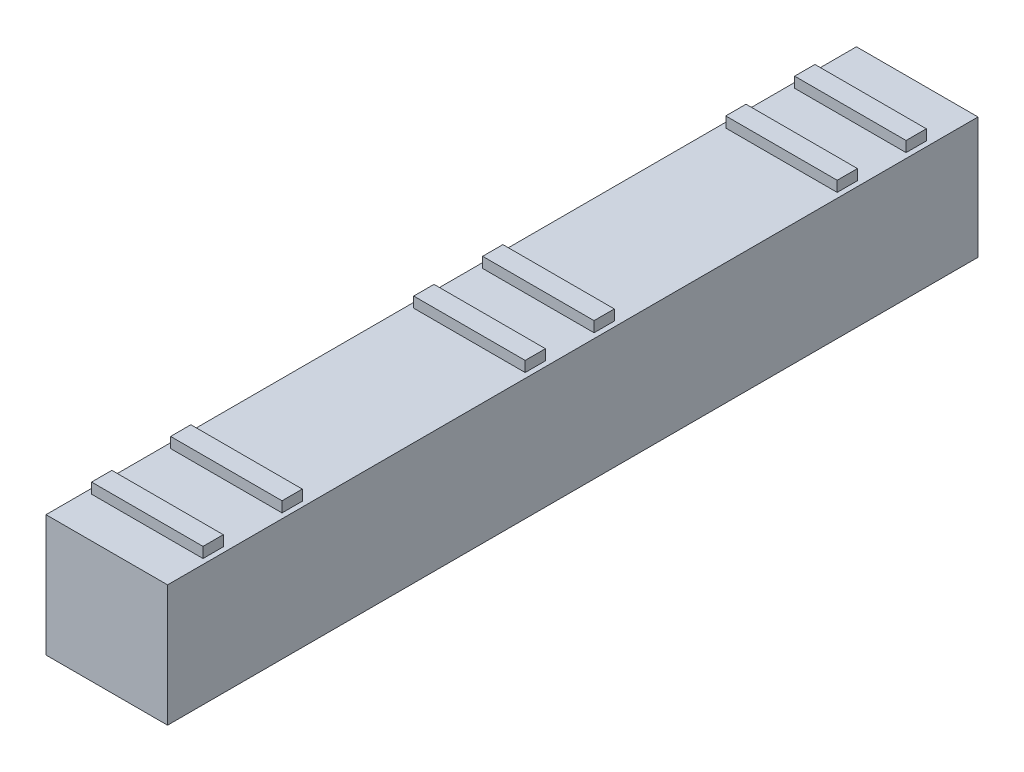
ISO-10303-21;
HEADER;
FILE_DESCRIPTION(('STEP AP214'),'2;1');
FILE_NAME('part.step','',(''),(''),'','','');
FILE_SCHEMA(('AUTOMOTIVE_DESIGN { 1 0 10303 214 1 1 1 1 }'));
ENDSEC;
DATA;
#1=APPLICATION_CONTEXT('core data for automotive mechanical design processes');
#2=APPLICATION_PROTOCOL_DEFINITION('international standard','automotive_design',2000,#1);
#3=PRODUCT_CONTEXT('',#1,'mechanical');
#4=PRODUCT('Part','Part','',(#3));
#5=PRODUCT_RELATED_PRODUCT_CATEGORY('part','',(#4));
#6=PRODUCT_DEFINITION_FORMATION('','',#4);
#7=PRODUCT_DEFINITION_CONTEXT('part definition',#1,'design');
#8=PRODUCT_DEFINITION('design','',#6,#7);
#9=PRODUCT_DEFINITION_SHAPE('','',#8);
#10=(LENGTH_UNIT() NAMED_UNIT(*) SI_UNIT(.MILLI.,.METRE.));
#11=(NAMED_UNIT(*) PLANE_ANGLE_UNIT() SI_UNIT($,.RADIAN.));
#12=(NAMED_UNIT(*) SI_UNIT($,.STERADIAN.) SOLID_ANGLE_UNIT());
#13=UNCERTAINTY_MEASURE_WITH_UNIT(LENGTH_MEASURE(1.E-05),#10,'distance_accuracy_value','');
#14=(GEOMETRIC_REPRESENTATION_CONTEXT(3) GLOBAL_UNCERTAINTY_ASSIGNED_CONTEXT((#13)) GLOBAL_UNIT_ASSIGNED_CONTEXT((#10,
#11,#12)) REPRESENTATION_CONTEXT('',''));
#15=CARTESIAN_POINT('',(0.,0.,0.));
#16=DIRECTION('',(0.,0.,1.));
#17=DIRECTION('',(1.,0.,0.));
#18=AXIS2_PLACEMENT_3D('',#15,#16,#17);
#19=CARTESIAN_POINT('',(0.,30.,0.));
#20=DIRECTION('',(0.,-1.,0.));
#21=DIRECTION('',(0.,0.,-1.));
#22=AXIS2_PLACEMENT_3D('',#19,#20,#21);
#23=PLANE('',#22);
#24=DIRECTION('',(0.,0.,-1.));
#25=VECTOR('',#24,1.);
#26=CARTESIAN_POINT('',(13.75,30.,-71.5));
#27=LINE('',#26,#25);
#28=CARTESIAN_POINT('',(13.75,30.,-66.5));
#29=VERTEX_POINT('',#28);
#30=CARTESIAN_POINT('',(13.75,30.,-71.5));
#31=VERTEX_POINT('',#30);
#32=EDGE_CURVE('E245',#29,#31,#27,.T.);
#33=ORIENTED_EDGE('',*,*,#32,.F.);
#34=DIRECTION('',(1.,0.,0.));
#35=VECTOR('',#34,1.);
#36=CARTESIAN_POINT('',(-13.75,30.,-66.5));
#37=LINE('',#36,#35);
#38=CARTESIAN_POINT('',(-13.75,30.,-66.5));
#39=VERTEX_POINT('',#38);
#40=EDGE_CURVE('E258',#39,#29,#37,.T.);
#41=ORIENTED_EDGE('',*,*,#40,.F.);
#42=DIRECTION('',(0.,0.,1.));
#43=VECTOR('',#42,1.);
#44=CARTESIAN_POINT('',(-13.75,30.,-71.5));
#45=LINE('',#44,#43);
#46=CARTESIAN_POINT('',(-13.75,30.,-71.5));
#47=VERTEX_POINT('',#46);
#48=EDGE_CURVE('E267',#47,#39,#45,.T.);
#49=ORIENTED_EDGE('',*,*,#48,.F.);
#50=DIRECTION('',(-1.,0.,0.));
#51=VECTOR('',#50,1.);
#52=CARTESIAN_POINT('',(-13.75,30.,-71.5));
#53=LINE('',#52,#51);
#54=EDGE_CURVE('E248',#31,#47,#53,.T.);
#55=ORIENTED_EDGE('',*,*,#54,.F.);
#56=EDGE_LOOP('',(#33,#41,#49,#55));
#57=FACE_BOUND('',#56,.T.);
#58=DIRECTION('',(0.,0.,-1.));
#59=VECTOR('',#58,1.);
#60=CARTESIAN_POINT('',(13.75,30.,5.50000000000001));
#61=LINE('',#60,#59);
#62=CARTESIAN_POINT('',(13.75,30.,10.5));
#63=VERTEX_POINT('',#62);
#64=CARTESIAN_POINT('',(13.75,30.,5.50000000000001));
#65=VERTEX_POINT('',#64);
#66=EDGE_CURVE('E316',#63,#65,#61,.T.);
#67=ORIENTED_EDGE('',*,*,#66,.F.);
#68=DIRECTION('',(1.,0.,0.));
#69=VECTOR('',#68,1.);
#70=CARTESIAN_POINT('',(-13.75,30.,10.5));
#71=LINE('',#70,#69);
#72=CARTESIAN_POINT('',(-13.75,30.,10.5));
#73=VERTEX_POINT('',#72);
#74=EDGE_CURVE('E321',#73,#63,#71,.T.);
#75=ORIENTED_EDGE('',*,*,#74,.F.);
#76=DIRECTION('',(0.,0.,1.));
#77=VECTOR('',#76,1.);
#78=CARTESIAN_POINT('',(-13.75,30.,5.50000000000001));
#79=LINE('',#78,#77);
#80=CARTESIAN_POINT('',(-13.75,30.,5.50000000000001));
#81=VERTEX_POINT('',#80);
#82=EDGE_CURVE('E333',#81,#73,#79,.T.);
#83=ORIENTED_EDGE('',*,*,#82,.F.);
#84=DIRECTION('',(-1.,0.,0.));
#85=VECTOR('',#84,1.);
#86=CARTESIAN_POINT('',(-13.75,30.,5.50000000000001));
#87=LINE('',#86,#85);
#88=EDGE_CURVE('E330',#65,#81,#87,.T.);
#89=ORIENTED_EDGE('',*,*,#88,.F.);
#90=EDGE_LOOP('',(#67,#75,#83,#89));
#91=FACE_BOUND('',#90,.T.);
#92=DIRECTION('',(0.,0.,-1.));
#93=VECTOR('',#92,1.);
#94=CARTESIAN_POINT('',(13.75,30.,85.));
#95=LINE('',#94,#93);
#96=CARTESIAN_POINT('',(13.75,30.,90.));
#97=VERTEX_POINT('',#96);
#98=CARTESIAN_POINT('',(13.75,30.,85.));
#99=VERTEX_POINT('',#98);
#100=EDGE_CURVE('E382',#97,#99,#95,.T.);
#101=ORIENTED_EDGE('',*,*,#100,.F.);
#102=DIRECTION('',(1.,0.,0.));
#103=VECTOR('',#102,1.);
#104=CARTESIAN_POINT('',(-13.75,30.,90.));
#105=LINE('',#104,#103);
#106=CARTESIAN_POINT('',(-13.75,30.,90.));
#107=VERTEX_POINT('',#106);
#108=EDGE_CURVE('E387',#107,#97,#105,.T.);
#109=ORIENTED_EDGE('',*,*,#108,.F.);
#110=DIRECTION('',(0.,0.,1.));
#111=VECTOR('',#110,1.);
#112=CARTESIAN_POINT('',(-13.75,30.,85.));
#113=LINE('',#112,#111);
#114=CARTESIAN_POINT('',(-13.75,30.,85.));
#115=VERTEX_POINT('',#114);
#116=EDGE_CURVE('E399',#115,#107,#113,.T.);
#117=ORIENTED_EDGE('',*,*,#116,.F.);
#118=DIRECTION('',(-1.,0.,0.));
#119=VECTOR('',#118,1.);
#120=CARTESIAN_POINT('',(-13.75,30.,85.));
#121=LINE('',#120,#119);
#122=EDGE_CURVE('E396',#99,#115,#121,.T.);
#123=ORIENTED_EDGE('',*,*,#122,.F.);
#124=EDGE_LOOP('',(#101,#109,#117,#123));
#125=FACE_BOUND('',#124,.T.);
#126=DIRECTION('',(0.,0.,-1.));
#127=VECTOR('',#126,1.);
#128=CARTESIAN_POINT('',(15.,30.,100.));
#129=LINE('',#128,#127);
#130=CARTESIAN_POINT('',(15.,30.,100.));
#131=VERTEX_POINT('',#130);
#132=CARTESIAN_POINT('',(15.,30.,-100.));
#133=VERTEX_POINT('',#132);
#134=EDGE_CURVE('E416',#131,#133,#129,.T.);
#135=ORIENTED_EDGE('',*,*,#134,.T.);
#136=DIRECTION('',(-1.,0.,0.));
#137=VECTOR('',#136,1.);
#138=CARTESIAN_POINT('',(-15.,30.,-100.));
#139=LINE('',#138,#137);
#140=CARTESIAN_POINT('',(-15.,30.,-100.));
#141=VERTEX_POINT('',#140);
#142=EDGE_CURVE('E419',#133,#141,#139,.T.);
#143=ORIENTED_EDGE('',*,*,#142,.T.);
#144=DIRECTION('',(0.,0.,1.));
#145=VECTOR('',#144,1.);
#146=CARTESIAN_POINT('',(-15.,30.,100.));
#147=LINE('',#146,#145);
#148=CARTESIAN_POINT('',(-15.,30.,100.));
#149=VERTEX_POINT('',#148);
#150=EDGE_CURVE('E422',#141,#149,#147,.T.);
#151=ORIENTED_EDGE('',*,*,#150,.T.);
#152=DIRECTION('',(1.,0.,0.));
#153=VECTOR('',#152,1.);
#154=CARTESIAN_POINT('',(-15.,30.,100.));
#155=LINE('',#154,#153);
#156=EDGE_CURVE('E424',#149,#131,#155,.T.);
#157=ORIENTED_EDGE('',*,*,#156,.T.);
#158=EDGE_LOOP('',(#135,#143,#151,#157));
#159=FACE_BOUND('',#158,.T.);
#160=DIRECTION('',(0.,0.,-1.));
#161=VECTOR('',#160,1.);
#162=CARTESIAN_POINT('',(13.75,30.,65.5));
#163=LINE('',#162,#161);
#164=CARTESIAN_POINT('',(13.75,30.,70.5));
#165=VERTEX_POINT('',#164);
#166=CARTESIAN_POINT('',(13.75,30.,65.5));
#167=VERTEX_POINT('',#166);
#168=EDGE_CURVE('E349',#165,#167,#163,.T.);
#169=ORIENTED_EDGE('',*,*,#168,.F.);
#170=DIRECTION('',(1.,0.,0.));
#171=VECTOR('',#170,1.);
#172=CARTESIAN_POINT('',(-13.75,30.,70.5));
#173=LINE('',#172,#171);
#174=CARTESIAN_POINT('',(-13.75,30.,70.5));
#175=VERTEX_POINT('',#174);
#176=EDGE_CURVE('E354',#175,#165,#173,.T.);
#177=ORIENTED_EDGE('',*,*,#176,.F.);
#178=DIRECTION('',(0.,0.,1.));
#179=VECTOR('',#178,1.);
#180=CARTESIAN_POINT('',(-13.75,30.,65.5));
#181=LINE('',#180,#179);
#182=CARTESIAN_POINT('',(-13.75,30.,65.5));
#183=VERTEX_POINT('',#182);
#184=EDGE_CURVE('E366',#183,#175,#181,.T.);
#185=ORIENTED_EDGE('',*,*,#184,.F.);
#186=DIRECTION('',(-1.,0.,0.));
#187=VECTOR('',#186,1.);
#188=CARTESIAN_POINT('',(-13.75,30.,65.5));
#189=LINE('',#188,#187);
#190=EDGE_CURVE('E363',#167,#183,#189,.T.);
#191=ORIENTED_EDGE('',*,*,#190,.F.);
#192=EDGE_LOOP('',(#169,#177,#185,#191));
#193=FACE_BOUND('',#192,.T.);
#194=DIRECTION('',(0.,0.,-1.));
#195=VECTOR('',#194,1.);
#196=CARTESIAN_POINT('',(13.75,30.,-11.5));
#197=LINE('',#196,#195);
#198=CARTESIAN_POINT('',(13.75,30.,-6.49999999999999));
#199=VERTEX_POINT('',#198);
#200=CARTESIAN_POINT('',(13.75,30.,-11.5));
#201=VERTEX_POINT('',#200);
#202=EDGE_CURVE('E283',#199,#201,#197,.T.);
#203=ORIENTED_EDGE('',*,*,#202,.F.);
#204=DIRECTION('',(1.,0.,0.));
#205=VECTOR('',#204,1.);
#206=CARTESIAN_POINT('',(-13.75,30.,-6.49999999999999));
#207=LINE('',#206,#205);
#208=CARTESIAN_POINT('',(-13.75,30.,-6.49999999999999));
#209=VERTEX_POINT('',#208);
#210=EDGE_CURVE('E288',#209,#199,#207,.T.);
#211=ORIENTED_EDGE('',*,*,#210,.F.);
#212=DIRECTION('',(0.,0.,1.));
#213=VECTOR('',#212,1.);
#214=CARTESIAN_POINT('',(-13.75,30.,-11.5));
#215=LINE('',#214,#213);
#216=CARTESIAN_POINT('',(-13.75,30.,-11.5));
#217=VERTEX_POINT('',#216);
#218=EDGE_CURVE('E300',#217,#209,#215,.T.);
#219=ORIENTED_EDGE('',*,*,#218,.F.);
#220=DIRECTION('',(-1.,0.,0.));
#221=VECTOR('',#220,1.);
#222=CARTESIAN_POINT('',(-13.75,30.,-11.5));
#223=LINE('',#222,#221);
#224=EDGE_CURVE('E297',#201,#217,#223,.T.);
#225=ORIENTED_EDGE('',*,*,#224,.F.);
#226=EDGE_LOOP('',(#203,#211,#219,#225));
#227=FACE_BOUND('',#226,.T.);
#228=DIRECTION('',(0.,0.,-1.));
#229=VECTOR('',#228,1.);
#230=CARTESIAN_POINT('',(13.75,30.,-88.5));
#231=LINE('',#230,#229);
#232=CARTESIAN_POINT('',(13.75,30.,-83.5));
#233=VERTEX_POINT('',#232);
#234=CARTESIAN_POINT('',(13.75,30.,-88.5));
#235=VERTEX_POINT('',#234);
#236=EDGE_CURVE('E244',#233,#235,#231,.T.);
#237=ORIENTED_EDGE('',*,*,#236,.F.);
#238=DIRECTION('',(1.,0.,0.));
#239=VECTOR('',#238,1.);
#240=CARTESIAN_POINT('',(-13.75,30.,-83.5));
#241=LINE('',#240,#239);
#242=CARTESIAN_POINT('',(-13.75,30.,-83.5));
#243=VERTEX_POINT('',#242);
#244=EDGE_CURVE('E241',#243,#233,#241,.T.);
#245=ORIENTED_EDGE('',*,*,#244,.F.);
#246=DIRECTION('',(0.,0.,1.));
#247=VECTOR('',#246,1.);
#248=CARTESIAN_POINT('',(-13.75,30.,-88.5));
#249=LINE('',#248,#247);
#250=CARTESIAN_POINT('',(-13.75,30.,-88.5));
#251=VERTEX_POINT('',#250);
#252=EDGE_CURVE('E59',#251,#243,#249,.T.);
#253=ORIENTED_EDGE('',*,*,#252,.F.);
#254=DIRECTION('',(-1.,0.,0.));
#255=VECTOR('',#254,1.);
#256=CARTESIAN_POINT('',(-13.75,30.,-88.5));
#257=LINE('',#256,#255);
#258=EDGE_CURVE('E54',#235,#251,#257,.T.);
#259=ORIENTED_EDGE('',*,*,#258,.F.);
#260=EDGE_LOOP('',(#237,#245,#253,#259));
#261=FACE_BOUND('',#260,.T.);
#262=ADVANCED_FACE('F39',(#57,#91,#125,#159,#193,#227,#261),#23,.F.);
#263=CARTESIAN_POINT('',(15.,30.,100.));
#264=DIRECTION('',(-1.,0.,0.));
#265=DIRECTION('',(0.,0.,1.));
#266=AXIS2_PLACEMENT_3D('',#263,#264,#265);
#267=PLANE('',#266);
#268=DIRECTION('',(0.,0.,-1.));
#269=VECTOR('',#268,1.);
#270=CARTESIAN_POINT('',(15.,0.,100.));
#271=LINE('',#270,#269);
#272=CARTESIAN_POINT('',(15.,0.,100.));
#273=VERTEX_POINT('',#272);
#274=CARTESIAN_POINT('',(15.,0.,-100.));
#275=VERTEX_POINT('',#274);
#276=EDGE_CURVE('E415',#273,#275,#271,.T.);
#277=ORIENTED_EDGE('',*,*,#276,.T.);
#278=DIRECTION('',(0.,-1.,0.));
#279=VECTOR('',#278,1.);
#280=CARTESIAN_POINT('',(15.,30.,-100.));
#281=LINE('',#280,#279);
#282=EDGE_CURVE('E11',#133,#275,#281,.T.);
#283=ORIENTED_EDGE('',*,*,#282,.F.);
#284=ORIENTED_EDGE('',*,*,#134,.F.);
#285=DIRECTION('',(0.,-1.,0.));
#286=VECTOR('',#285,1.);
#287=CARTESIAN_POINT('',(15.,30.,100.));
#288=LINE('',#287,#286);
#289=EDGE_CURVE('E426',#131,#273,#288,.T.);
#290=ORIENTED_EDGE('',*,*,#289,.T.);
#291=EDGE_LOOP('',(#277,#283,#284,#290));
#292=FACE_BOUND('',#291,.T.);
#293=ADVANCED_FACE('F41',(#292),#267,.F.);
#294=CARTESIAN_POINT('',(-15.,30.,-100.));
#295=DIRECTION('',(0.,0.,1.));
#296=DIRECTION('',(1.,0.,0.));
#297=AXIS2_PLACEMENT_3D('',#294,#295,#296);
#298=PLANE('',#297);
#299=DIRECTION('',(-1.,0.,0.));
#300=VECTOR('',#299,1.);
#301=CARTESIAN_POINT('',(-15.,0.,-100.));
#302=LINE('',#301,#300);
#303=CARTESIAN_POINT('',(-15.,0.,-100.));
#304=VERTEX_POINT('',#303);
#305=EDGE_CURVE('E429',#275,#304,#302,.T.);
#306=ORIENTED_EDGE('',*,*,#305,.T.);
#307=DIRECTION('',(0.,-1.,0.));
#308=VECTOR('',#307,1.);
#309=CARTESIAN_POINT('',(-15.,30.,-100.));
#310=LINE('',#309,#308);
#311=EDGE_CURVE('E47',#141,#304,#310,.T.);
#312=ORIENTED_EDGE('',*,*,#311,.F.);
#313=ORIENTED_EDGE('',*,*,#142,.F.);
#314=ORIENTED_EDGE('',*,*,#282,.T.);
#315=EDGE_LOOP('',(#306,#312,#313,#314));
#316=FACE_BOUND('',#315,.T.);
#317=ADVANCED_FACE('F459',(#316),#298,.F.);
#318=CARTESIAN_POINT('',(-15.,30.,100.));
#319=DIRECTION('',(1.,0.,0.));
#320=DIRECTION('',(0.,0.,-1.));
#321=AXIS2_PLACEMENT_3D('',#318,#319,#320);
#322=PLANE('',#321);
#323=DIRECTION('',(0.,0.,1.));
#324=VECTOR('',#323,1.);
#325=CARTESIAN_POINT('',(-15.,0.,100.));
#326=LINE('',#325,#324);
#327=CARTESIAN_POINT('',(-15.,0.,100.));
#328=VERTEX_POINT('',#327);
#329=EDGE_CURVE('E431',#304,#328,#326,.T.);
#330=ORIENTED_EDGE('',*,*,#329,.T.);
#331=DIRECTION('',(0.,-1.,0.));
#332=VECTOR('',#331,1.);
#333=CARTESIAN_POINT('',(-15.,30.,100.));
#334=LINE('',#333,#332);
#335=EDGE_CURVE('E436',#149,#328,#334,.T.);
#336=ORIENTED_EDGE('',*,*,#335,.F.);
#337=ORIENTED_EDGE('',*,*,#150,.F.);
#338=ORIENTED_EDGE('',*,*,#311,.T.);
#339=EDGE_LOOP('',(#330,#336,#337,#338));
#340=FACE_BOUND('',#339,.T.);
#341=ADVANCED_FACE('F443',(#340),#322,.F.);
#342=CARTESIAN_POINT('',(-15.,30.,100.));
#343=DIRECTION('',(0.,0.,-1.));
#344=DIRECTION('',(-1.,0.,0.));
#345=AXIS2_PLACEMENT_3D('',#342,#343,#344);
#346=PLANE('',#345);
#347=DIRECTION('',(1.,0.,0.));
#348=VECTOR('',#347,1.);
#349=CARTESIAN_POINT('',(-15.,0.,100.));
#350=LINE('',#349,#348);
#351=EDGE_CURVE('E420',#328,#273,#350,.T.);
#352=ORIENTED_EDGE('',*,*,#351,.T.);
#353=ORIENTED_EDGE('',*,*,#289,.F.);
#354=ORIENTED_EDGE('',*,*,#156,.F.);
#355=ORIENTED_EDGE('',*,*,#335,.T.);
#356=EDGE_LOOP('',(#352,#353,#354,#355));
#357=FACE_BOUND('',#356,.T.);
#358=ADVANCED_FACE('F452',(#357),#346,.F.);
#359=CARTESIAN_POINT('',(0.,0.,0.));
#360=DIRECTION('',(0.,-1.,0.));
#361=DIRECTION('',(0.,0.,-1.));
#362=AXIS2_PLACEMENT_3D('',#359,#360,#361);
#363=PLANE('',#362);
#364=ORIENTED_EDGE('',*,*,#276,.F.);
#365=ORIENTED_EDGE('',*,*,#351,.F.);
#366=ORIENTED_EDGE('',*,*,#329,.F.);
#367=ORIENTED_EDGE('',*,*,#305,.F.);
#368=EDGE_LOOP('',(#364,#365,#366,#367));
#369=FACE_BOUND('',#368,.T.);
#370=ADVANCED_FACE('F449',(#369),#363,.T.);
#371=CARTESIAN_POINT('',(13.75,32.6,85.));
#372=DIRECTION('',(-1.,0.,0.));
#373=DIRECTION('',(0.,0.,1.));
#374=AXIS2_PLACEMENT_3D('',#371,#372,#373);
#375=PLANE('',#374);
#376=ORIENTED_EDGE('',*,*,#100,.T.);
#377=DIRECTION('',(0.,-1.,0.));
#378=VECTOR('',#377,1.);
#379=CARTESIAN_POINT('',(13.75,32.6,85.));
#380=LINE('',#379,#378);
#381=CARTESIAN_POINT('',(13.75,32.6,85.));
#382=VERTEX_POINT('',#381);
#383=EDGE_CURVE('E412',#382,#99,#380,.T.);
#384=ORIENTED_EDGE('',*,*,#383,.F.);
#385=DIRECTION('',(0.,0.,-1.));
#386=VECTOR('',#385,1.);
#387=CARTESIAN_POINT('',(13.75,32.6,85.));
#388=LINE('',#387,#386);
#389=CARTESIAN_POINT('',(13.75,32.6,90.));
#390=VERTEX_POINT('',#389);
#391=EDGE_CURVE('E383',#390,#382,#388,.T.);
#392=ORIENTED_EDGE('',*,*,#391,.F.);
#393=DIRECTION('',(0.,-1.,0.));
#394=VECTOR('',#393,1.);
#395=CARTESIAN_POINT('',(13.75,32.6,90.));
#396=LINE('',#395,#394);
#397=EDGE_CURVE('E393',#390,#97,#396,.T.);
#398=ORIENTED_EDGE('',*,*,#397,.T.);
#399=EDGE_LOOP('',(#376,#384,#392,#398));
#400=FACE_BOUND('',#399,.T.);
#401=ADVANCED_FACE('F474',(#400),#375,.F.);
#402=CARTESIAN_POINT('',(-13.75,32.6,85.));
#403=DIRECTION('',(0.,0.,1.));
#404=DIRECTION('',(1.,0.,0.));
#405=AXIS2_PLACEMENT_3D('',#402,#403,#404);
#406=PLANE('',#405);
#407=ORIENTED_EDGE('',*,*,#122,.T.);
#408=DIRECTION('',(0.,-1.,0.));
#409=VECTOR('',#408,1.);
#410=CARTESIAN_POINT('',(-13.75,32.6,85.));
#411=LINE('',#410,#409);
#412=CARTESIAN_POINT('',(-13.75,32.6,85.));
#413=VERTEX_POINT('',#412);
#414=EDGE_CURVE('E409',#413,#115,#411,.T.);
#415=ORIENTED_EDGE('',*,*,#414,.F.);
#416=DIRECTION('',(-1.,0.,0.));
#417=VECTOR('',#416,1.);
#418=CARTESIAN_POINT('',(-13.75,32.6,85.));
#419=LINE('',#418,#417);
#420=EDGE_CURVE('E386',#382,#413,#419,.T.);
#421=ORIENTED_EDGE('',*,*,#420,.F.);
#422=ORIENTED_EDGE('',*,*,#383,.T.);
#423=EDGE_LOOP('',(#407,#415,#421,#422));
#424=FACE_BOUND('',#423,.T.);
#425=ADVANCED_FACE('F493',(#424),#406,.F.);
#426=CARTESIAN_POINT('',(-13.75,32.6,85.));
#427=DIRECTION('',(1.,0.,0.));
#428=DIRECTION('',(0.,0.,-1.));
#429=AXIS2_PLACEMENT_3D('',#426,#427,#428);
#430=PLANE('',#429);
#431=ORIENTED_EDGE('',*,*,#116,.T.);
#432=DIRECTION('',(0.,-1.,0.));
#433=VECTOR('',#432,1.);
#434=CARTESIAN_POINT('',(-13.75,32.6,90.));
#435=LINE('',#434,#433);
#436=CARTESIAN_POINT('',(-13.75,32.6,90.));
#437=VERTEX_POINT('',#436);
#438=EDGE_CURVE('E406',#437,#107,#435,.T.);
#439=ORIENTED_EDGE('',*,*,#438,.F.);
#440=DIRECTION('',(0.,0.,1.));
#441=VECTOR('',#440,1.);
#442=CARTESIAN_POINT('',(-13.75,32.6,85.));
#443=LINE('',#442,#441);
#444=EDGE_CURVE('E389',#413,#437,#443,.T.);
#445=ORIENTED_EDGE('',*,*,#444,.F.);
#446=ORIENTED_EDGE('',*,*,#414,.T.);
#447=EDGE_LOOP('',(#431,#439,#445,#446));
#448=FACE_BOUND('',#447,.T.);
#449=ADVANCED_FACE('F500',(#448),#430,.F.);
#450=CARTESIAN_POINT('',(-13.75,32.6,90.));
#451=DIRECTION('',(0.,0.,-1.));
#452=DIRECTION('',(-1.,0.,0.));
#453=AXIS2_PLACEMENT_3D('',#450,#451,#452);
#454=PLANE('',#453);
#455=ORIENTED_EDGE('',*,*,#108,.T.);
#456=ORIENTED_EDGE('',*,*,#397,.F.);
#457=DIRECTION('',(1.,0.,0.));
#458=VECTOR('',#457,1.);
#459=CARTESIAN_POINT('',(-13.75,32.6,90.));
#460=LINE('',#459,#458);
#461=EDGE_CURVE('E391',#437,#390,#460,.T.);
#462=ORIENTED_EDGE('',*,*,#461,.F.);
#463=ORIENTED_EDGE('',*,*,#438,.T.);
#464=EDGE_LOOP('',(#455,#456,#462,#463));
#465=FACE_BOUND('',#464,.T.);
#466=ADVANCED_FACE('F507',(#465),#454,.F.);
#467=CARTESIAN_POINT('',(0.,32.6,0.));
#468=DIRECTION('',(0.,1.,0.));
#469=DIRECTION('',(0.,0.,1.));
#470=AXIS2_PLACEMENT_3D('',#467,#468,#469);
#471=PLANE('',#470);
#472=ORIENTED_EDGE('',*,*,#391,.T.);
#473=ORIENTED_EDGE('',*,*,#420,.T.);
#474=ORIENTED_EDGE('',*,*,#444,.T.);
#475=ORIENTED_EDGE('',*,*,#461,.T.);
#476=EDGE_LOOP('',(#472,#473,#474,#475));
#477=FACE_BOUND('',#476,.T.);
#478=ADVANCED_FACE('F515',(#477),#471,.T.);
#479=CARTESIAN_POINT('',(13.75,32.6,65.5));
#480=DIRECTION('',(-1.,0.,0.));
#481=DIRECTION('',(0.,0.,1.));
#482=AXIS2_PLACEMENT_3D('',#479,#480,#481);
#483=PLANE('',#482);
#484=ORIENTED_EDGE('',*,*,#168,.T.);
#485=DIRECTION('',(0.,-1.,0.));
#486=VECTOR('',#485,1.);
#487=CARTESIAN_POINT('',(13.75,32.6,65.5));
#488=LINE('',#487,#486);
#489=CARTESIAN_POINT('',(13.75,32.6,65.5));
#490=VERTEX_POINT('',#489);
#491=EDGE_CURVE('E379',#490,#167,#488,.T.);
#492=ORIENTED_EDGE('',*,*,#491,.F.);
#493=DIRECTION('',(0.,0.,-1.));
#494=VECTOR('',#493,1.);
#495=CARTESIAN_POINT('',(13.75,32.6,65.5));
#496=LINE('',#495,#494);
#497=CARTESIAN_POINT('',(13.75,32.6,70.5));
#498=VERTEX_POINT('',#497);
#499=EDGE_CURVE('E350',#498,#490,#496,.T.);
#500=ORIENTED_EDGE('',*,*,#499,.F.);
#501=DIRECTION('',(0.,-1.,0.));
#502=VECTOR('',#501,1.);
#503=CARTESIAN_POINT('',(13.75,32.6,70.5));
#504=LINE('',#503,#502);
#505=EDGE_CURVE('E360',#498,#165,#504,.T.);
#506=ORIENTED_EDGE('',*,*,#505,.T.);
#507=EDGE_LOOP('',(#484,#492,#500,#506));
#508=FACE_BOUND('',#507,.T.);
#509=ADVANCED_FACE('F523',(#508),#483,.F.);
#510=CARTESIAN_POINT('',(-13.75,32.6,65.5));
#511=DIRECTION('',(0.,0.,1.));
#512=DIRECTION('',(1.,0.,0.));
#513=AXIS2_PLACEMENT_3D('',#510,#511,#512);
#514=PLANE('',#513);
#515=ORIENTED_EDGE('',*,*,#190,.T.);
#516=DIRECTION('',(0.,-1.,0.));
#517=VECTOR('',#516,1.);
#518=CARTESIAN_POINT('',(-13.75,32.6,65.5));
#519=LINE('',#518,#517);
#520=CARTESIAN_POINT('',(-13.75,32.6,65.5));
#521=VERTEX_POINT('',#520);
#522=EDGE_CURVE('E376',#521,#183,#519,.T.);
#523=ORIENTED_EDGE('',*,*,#522,.F.);
#524=DIRECTION('',(-1.,0.,0.));
#525=VECTOR('',#524,1.);
#526=CARTESIAN_POINT('',(-13.75,32.6,65.5));
#527=LINE('',#526,#525);
#528=EDGE_CURVE('E353',#490,#521,#527,.T.);
#529=ORIENTED_EDGE('',*,*,#528,.F.);
#530=ORIENTED_EDGE('',*,*,#491,.T.);
#531=EDGE_LOOP('',(#515,#523,#529,#530));
#532=FACE_BOUND('',#531,.T.);
#533=ADVANCED_FACE('F531',(#532),#514,.F.);
#534=CARTESIAN_POINT('',(-13.75,32.6,65.5));
#535=DIRECTION('',(1.,0.,0.));
#536=DIRECTION('',(0.,0.,-1.));
#537=AXIS2_PLACEMENT_3D('',#534,#535,#536);
#538=PLANE('',#537);
#539=ORIENTED_EDGE('',*,*,#184,.T.);
#540=DIRECTION('',(0.,-1.,0.));
#541=VECTOR('',#540,1.);
#542=CARTESIAN_POINT('',(-13.75,32.6,70.5));
#543=LINE('',#542,#541);
#544=CARTESIAN_POINT('',(-13.75,32.6,70.5));
#545=VERTEX_POINT('',#544);
#546=EDGE_CURVE('E373',#545,#175,#543,.T.);
#547=ORIENTED_EDGE('',*,*,#546,.F.);
#548=DIRECTION('',(0.,0.,1.));
#549=VECTOR('',#548,1.);
#550=CARTESIAN_POINT('',(-13.75,32.6,65.5));
#551=LINE('',#550,#549);
#552=EDGE_CURVE('E356',#521,#545,#551,.T.);
#553=ORIENTED_EDGE('',*,*,#552,.F.);
#554=ORIENTED_EDGE('',*,*,#522,.T.);
#555=EDGE_LOOP('',(#539,#547,#553,#554));
#556=FACE_BOUND('',#555,.T.);
#557=ADVANCED_FACE('F539',(#556),#538,.F.);
#558=CARTESIAN_POINT('',(-13.75,32.6,70.5));
#559=DIRECTION('',(0.,0.,-1.));
#560=DIRECTION('',(-1.,0.,0.));
#561=AXIS2_PLACEMENT_3D('',#558,#559,#560);
#562=PLANE('',#561);
#563=ORIENTED_EDGE('',*,*,#176,.T.);
#564=ORIENTED_EDGE('',*,*,#505,.F.);
#565=DIRECTION('',(1.,0.,0.));
#566=VECTOR('',#565,1.);
#567=CARTESIAN_POINT('',(-13.75,32.6,70.5));
#568=LINE('',#567,#566);
#569=EDGE_CURVE('E358',#545,#498,#568,.T.);
#570=ORIENTED_EDGE('',*,*,#569,.F.);
#571=ORIENTED_EDGE('',*,*,#546,.T.);
#572=EDGE_LOOP('',(#563,#564,#570,#571));
#573=FACE_BOUND('',#572,.T.);
#574=ADVANCED_FACE('F547',(#573),#562,.F.);
#575=CARTESIAN_POINT('',(0.,32.6,-19.5));
#576=DIRECTION('',(0.,1.,0.));
#577=DIRECTION('',(0.,0.,1.));
#578=AXIS2_PLACEMENT_3D('',#575,#576,#577);
#579=PLANE('',#578);
#580=ORIENTED_EDGE('',*,*,#499,.T.);
#581=ORIENTED_EDGE('',*,*,#528,.T.);
#582=ORIENTED_EDGE('',*,*,#552,.T.);
#583=ORIENTED_EDGE('',*,*,#569,.T.);
#584=EDGE_LOOP('',(#580,#581,#582,#583));
#585=FACE_BOUND('',#584,.T.);
#586=ADVANCED_FACE('F555',(#585),#579,.T.);
#587=CARTESIAN_POINT('',(13.75,32.6,5.50000000000001));
#588=DIRECTION('',(-1.,0.,0.));
#589=DIRECTION('',(0.,0.,1.));
#590=AXIS2_PLACEMENT_3D('',#587,#588,#589);
#591=PLANE('',#590);
#592=ORIENTED_EDGE('',*,*,#66,.T.);
#593=DIRECTION('',(0.,-1.,0.));
#594=VECTOR('',#593,1.);
#595=CARTESIAN_POINT('',(13.75,32.6,5.50000000000001));
#596=LINE('',#595,#594);
#597=CARTESIAN_POINT('',(13.75,32.6,5.50000000000001));
#598=VERTEX_POINT('',#597);
#599=EDGE_CURVE('E346',#598,#65,#596,.T.);
#600=ORIENTED_EDGE('',*,*,#599,.F.);
#601=DIRECTION('',(0.,0.,-1.));
#602=VECTOR('',#601,1.);
#603=CARTESIAN_POINT('',(13.75,32.6,5.50000000000001));
#604=LINE('',#603,#602);
#605=CARTESIAN_POINT('',(13.75,32.6,10.5));
#606=VERTEX_POINT('',#605);
#607=EDGE_CURVE('E317',#606,#598,#604,.T.);
#608=ORIENTED_EDGE('',*,*,#607,.F.);
#609=DIRECTION('',(0.,-1.,0.));
#610=VECTOR('',#609,1.);
#611=CARTESIAN_POINT('',(13.75,32.6,10.5));
#612=LINE('',#611,#610);
#613=EDGE_CURVE('E327',#606,#63,#612,.T.);
#614=ORIENTED_EDGE('',*,*,#613,.T.);
#615=EDGE_LOOP('',(#592,#600,#608,#614));
#616=FACE_BOUND('',#615,.T.);
#617=ADVANCED_FACE('F563',(#616),#591,.F.);
#618=CARTESIAN_POINT('',(-13.75,32.6,5.50000000000001));
#619=DIRECTION('',(0.,0.,1.));
#620=DIRECTION('',(1.,0.,0.));
#621=AXIS2_PLACEMENT_3D('',#618,#619,#620);
#622=PLANE('',#621);
#623=ORIENTED_EDGE('',*,*,#88,.T.);
#624=DIRECTION('',(0.,-1.,0.));
#625=VECTOR('',#624,1.);
#626=CARTESIAN_POINT('',(-13.75,32.6,5.50000000000001));
#627=LINE('',#626,#625);
#628=CARTESIAN_POINT('',(-13.75,32.6,5.50000000000001));
#629=VERTEX_POINT('',#628);
#630=EDGE_CURVE('E343',#629,#81,#627,.T.);
#631=ORIENTED_EDGE('',*,*,#630,.F.);
#632=DIRECTION('',(-1.,0.,0.));
#633=VECTOR('',#632,1.);
#634=CARTESIAN_POINT('',(-13.75,32.6,5.50000000000001));
#635=LINE('',#634,#633);
#636=EDGE_CURVE('E320',#598,#629,#635,.T.);
#637=ORIENTED_EDGE('',*,*,#636,.F.);
#638=ORIENTED_EDGE('',*,*,#599,.T.);
#639=EDGE_LOOP('',(#623,#631,#637,#638));
#640=FACE_BOUND('',#639,.T.);
#641=ADVANCED_FACE('F571',(#640),#622,.F.);
#642=CARTESIAN_POINT('',(-13.75,32.6,5.50000000000001));
#643=DIRECTION('',(1.,0.,0.));
#644=DIRECTION('',(0.,0.,-1.));
#645=AXIS2_PLACEMENT_3D('',#642,#643,#644);
#646=PLANE('',#645);
#647=ORIENTED_EDGE('',*,*,#82,.T.);
#648=DIRECTION('',(0.,-1.,0.));
#649=VECTOR('',#648,1.);
#650=CARTESIAN_POINT('',(-13.75,32.6,10.5));
#651=LINE('',#650,#649);
#652=CARTESIAN_POINT('',(-13.75,32.6,10.5));
#653=VERTEX_POINT('',#652);
#654=EDGE_CURVE('E340',#653,#73,#651,.T.);
#655=ORIENTED_EDGE('',*,*,#654,.F.);
#656=DIRECTION('',(0.,0.,1.));
#657=VECTOR('',#656,1.);
#658=CARTESIAN_POINT('',(-13.75,32.6,5.50000000000001));
#659=LINE('',#658,#657);
#660=EDGE_CURVE('E323',#629,#653,#659,.T.);
#661=ORIENTED_EDGE('',*,*,#660,.F.);
#662=ORIENTED_EDGE('',*,*,#630,.T.);
#663=EDGE_LOOP('',(#647,#655,#661,#662));
#664=FACE_BOUND('',#663,.T.);
#665=ADVANCED_FACE('F579',(#664),#646,.F.);
#666=CARTESIAN_POINT('',(-13.75,32.6,10.5));
#667=DIRECTION('',(0.,0.,-1.));
#668=DIRECTION('',(-1.,0.,0.));
#669=AXIS2_PLACEMENT_3D('',#666,#667,#668);
#670=PLANE('',#669);
#671=ORIENTED_EDGE('',*,*,#74,.T.);
#672=ORIENTED_EDGE('',*,*,#613,.F.);
#673=DIRECTION('',(1.,0.,0.));
#674=VECTOR('',#673,1.);
#675=CARTESIAN_POINT('',(-13.75,32.6,10.5));
#676=LINE('',#675,#674);
#677=EDGE_CURVE('E325',#653,#606,#676,.T.);
#678=ORIENTED_EDGE('',*,*,#677,.F.);
#679=ORIENTED_EDGE('',*,*,#654,.T.);
#680=EDGE_LOOP('',(#671,#672,#678,#679));
#681=FACE_BOUND('',#680,.T.);
#682=ADVANCED_FACE('F587',(#681),#670,.F.);
#683=CARTESIAN_POINT('',(0.,32.6,-79.5));
#684=DIRECTION('',(0.,1.,0.));
#685=DIRECTION('',(0.,0.,1.));
#686=AXIS2_PLACEMENT_3D('',#683,#684,#685);
#687=PLANE('',#686);
#688=ORIENTED_EDGE('',*,*,#607,.T.);
#689=ORIENTED_EDGE('',*,*,#636,.T.);
#690=ORIENTED_EDGE('',*,*,#660,.T.);
#691=ORIENTED_EDGE('',*,*,#677,.T.);
#692=EDGE_LOOP('',(#688,#689,#690,#691));
#693=FACE_BOUND('',#692,.T.);
#694=ADVANCED_FACE('F595',(#693),#687,.T.);
#695=CARTESIAN_POINT('',(13.75,32.6,-11.5));
#696=DIRECTION('',(-1.,0.,0.));
#697=DIRECTION('',(0.,0.,1.));
#698=AXIS2_PLACEMENT_3D('',#695,#696,#697);
#699=PLANE('',#698);
#700=ORIENTED_EDGE('',*,*,#202,.T.);
#701=DIRECTION('',(0.,-1.,0.));
#702=VECTOR('',#701,1.);
#703=CARTESIAN_POINT('',(13.75,32.6,-11.5));
#704=LINE('',#703,#702);
#705=CARTESIAN_POINT('',(13.75,32.6,-11.5));
#706=VERTEX_POINT('',#705);
#707=EDGE_CURVE('E313',#706,#201,#704,.T.);
#708=ORIENTED_EDGE('',*,*,#707,.F.);
#709=DIRECTION('',(0.,0.,-1.));
#710=VECTOR('',#709,1.);
#711=CARTESIAN_POINT('',(13.75,32.6,-11.5));
#712=LINE('',#711,#710);
#713=CARTESIAN_POINT('',(13.75,32.6,-6.49999999999999));
#714=VERTEX_POINT('',#713);
#715=EDGE_CURVE('E284',#714,#706,#712,.T.);
#716=ORIENTED_EDGE('',*,*,#715,.F.);
#717=DIRECTION('',(0.,-1.,0.));
#718=VECTOR('',#717,1.);
#719=CARTESIAN_POINT('',(13.75,32.6,-6.49999999999999));
#720=LINE('',#719,#718);
#721=EDGE_CURVE('E294',#714,#199,#720,.T.);
#722=ORIENTED_EDGE('',*,*,#721,.T.);
#723=EDGE_LOOP('',(#700,#708,#716,#722));
#724=FACE_BOUND('',#723,.T.);
#725=ADVANCED_FACE('F603',(#724),#699,.F.);
#726=CARTESIAN_POINT('',(-13.75,32.6,-11.5));
#727=DIRECTION('',(0.,0.,1.));
#728=DIRECTION('',(1.,0.,0.));
#729=AXIS2_PLACEMENT_3D('',#726,#727,#728);
#730=PLANE('',#729);
#731=ORIENTED_EDGE('',*,*,#224,.T.);
#732=DIRECTION('',(0.,-1.,0.));
#733=VECTOR('',#732,1.);
#734=CARTESIAN_POINT('',(-13.75,32.6,-11.5));
#735=LINE('',#734,#733);
#736=CARTESIAN_POINT('',(-13.75,32.6,-11.5));
#737=VERTEX_POINT('',#736);
#738=EDGE_CURVE('E310',#737,#217,#735,.T.);
#739=ORIENTED_EDGE('',*,*,#738,.F.);
#740=DIRECTION('',(-1.,0.,0.));
#741=VECTOR('',#740,1.);
#742=CARTESIAN_POINT('',(-13.75,32.6,-11.5));
#743=LINE('',#742,#741);
#744=EDGE_CURVE('E287',#706,#737,#743,.T.);
#745=ORIENTED_EDGE('',*,*,#744,.F.);
#746=ORIENTED_EDGE('',*,*,#707,.T.);
#747=EDGE_LOOP('',(#731,#739,#745,#746));
#748=FACE_BOUND('',#747,.T.);
#749=ADVANCED_FACE('F611',(#748),#730,.F.);
#750=CARTESIAN_POINT('',(-13.75,32.6,-11.5));
#751=DIRECTION('',(1.,0.,0.));
#752=DIRECTION('',(0.,0.,-1.));
#753=AXIS2_PLACEMENT_3D('',#750,#751,#752);
#754=PLANE('',#753);
#755=ORIENTED_EDGE('',*,*,#218,.T.);
#756=DIRECTION('',(0.,-1.,0.));
#757=VECTOR('',#756,1.);
#758=CARTESIAN_POINT('',(-13.75,32.6,-6.49999999999999));
#759=LINE('',#758,#757);
#760=CARTESIAN_POINT('',(-13.75,32.6,-6.49999999999999));
#761=VERTEX_POINT('',#760);
#762=EDGE_CURVE('E307',#761,#209,#759,.T.);
#763=ORIENTED_EDGE('',*,*,#762,.F.);
#764=DIRECTION('',(0.,0.,1.));
#765=VECTOR('',#764,1.);
#766=CARTESIAN_POINT('',(-13.75,32.6,-11.5));
#767=LINE('',#766,#765);
#768=EDGE_CURVE('E290',#737,#761,#767,.T.);
#769=ORIENTED_EDGE('',*,*,#768,.F.);
#770=ORIENTED_EDGE('',*,*,#738,.T.);
#771=EDGE_LOOP('',(#755,#763,#769,#770));
#772=FACE_BOUND('',#771,.T.);
#773=ADVANCED_FACE('F619',(#772),#754,.F.);
#774=CARTESIAN_POINT('',(-13.75,32.6,-6.49999999999999));
#775=DIRECTION('',(0.,0.,-1.));
#776=DIRECTION('',(-1.,0.,0.));
#777=AXIS2_PLACEMENT_3D('',#774,#775,#776);
#778=PLANE('',#777);
#779=ORIENTED_EDGE('',*,*,#210,.T.);
#780=ORIENTED_EDGE('',*,*,#721,.F.);
#781=DIRECTION('',(1.,0.,0.));
#782=VECTOR('',#781,1.);
#783=CARTESIAN_POINT('',(-13.75,32.6,-6.49999999999999));
#784=LINE('',#783,#782);
#785=EDGE_CURVE('E292',#761,#714,#784,.T.);
#786=ORIENTED_EDGE('',*,*,#785,.F.);
#787=ORIENTED_EDGE('',*,*,#762,.T.);
#788=EDGE_LOOP('',(#779,#780,#786,#787));
#789=FACE_BOUND('',#788,.T.);
#790=ADVANCED_FACE('F627',(#789),#778,.F.);
#791=CARTESIAN_POINT('',(0.,32.6,-96.5));
#792=DIRECTION('',(0.,1.,0.));
#793=DIRECTION('',(0.,0.,1.));
#794=AXIS2_PLACEMENT_3D('',#791,#792,#793);
#795=PLANE('',#794);
#796=ORIENTED_EDGE('',*,*,#715,.T.);
#797=ORIENTED_EDGE('',*,*,#744,.T.);
#798=ORIENTED_EDGE('',*,*,#768,.T.);
#799=ORIENTED_EDGE('',*,*,#785,.T.);
#800=EDGE_LOOP('',(#796,#797,#798,#799));
#801=FACE_BOUND('',#800,.T.);
#802=ADVANCED_FACE('F635',(#801),#795,.T.);
#803=CARTESIAN_POINT('',(13.75,32.6,-71.5));
#804=DIRECTION('',(-1.,0.,0.));
#805=DIRECTION('',(0.,0.,1.));
#806=AXIS2_PLACEMENT_3D('',#803,#804,#805);
#807=PLANE('',#806);
#808=ORIENTED_EDGE('',*,*,#32,.T.);
#809=DIRECTION('',(0.,-1.,0.));
#810=VECTOR('',#809,1.);
#811=CARTESIAN_POINT('',(13.75,32.6,-71.5));
#812=LINE('',#811,#810);
#813=CARTESIAN_POINT('',(13.75,32.6,-71.5));
#814=VERTEX_POINT('',#813);
#815=EDGE_CURVE('E280',#814,#31,#812,.T.);
#816=ORIENTED_EDGE('',*,*,#815,.F.);
#817=DIRECTION('',(0.,0.,-1.));
#818=VECTOR('',#817,1.);
#819=CARTESIAN_POINT('',(13.75,32.6,-71.5));
#820=LINE('',#819,#818);
#821=CARTESIAN_POINT('',(13.75,32.6,-66.5));
#822=VERTEX_POINT('',#821);
#823=EDGE_CURVE('E254',#822,#814,#820,.T.);
#824=ORIENTED_EDGE('',*,*,#823,.F.);
#825=DIRECTION('',(0.,-1.,0.));
#826=VECTOR('',#825,1.);
#827=CARTESIAN_POINT('',(13.75,32.6,-66.5));
#828=LINE('',#827,#826);
#829=EDGE_CURVE('E263',#822,#29,#828,.T.);
#830=ORIENTED_EDGE('',*,*,#829,.T.);
#831=EDGE_LOOP('',(#808,#816,#824,#830));
#832=FACE_BOUND('',#831,.T.);
#833=ADVANCED_FACE('F643',(#832),#807,.F.);
#834=CARTESIAN_POINT('',(-13.75,32.6,-71.5));
#835=DIRECTION('',(0.,0.,1.));
#836=DIRECTION('',(1.,0.,0.));
#837=AXIS2_PLACEMENT_3D('',#834,#835,#836);
#838=PLANE('',#837);
#839=ORIENTED_EDGE('',*,*,#54,.T.);
#840=DIRECTION('',(0.,-1.,0.));
#841=VECTOR('',#840,1.);
#842=CARTESIAN_POINT('',(-13.75,32.6,-71.5));
#843=LINE('',#842,#841);
#844=CARTESIAN_POINT('',(-13.75,32.6,-71.5));
#845=VERTEX_POINT('',#844);
#846=EDGE_CURVE('E277',#845,#47,#843,.T.);
#847=ORIENTED_EDGE('',*,*,#846,.F.);
#848=DIRECTION('',(-1.,0.,0.));
#849=VECTOR('',#848,1.);
#850=CARTESIAN_POINT('',(-13.75,32.6,-71.5));
#851=LINE('',#850,#849);
#852=EDGE_CURVE('E257',#814,#845,#851,.T.);
#853=ORIENTED_EDGE('',*,*,#852,.F.);
#854=ORIENTED_EDGE('',*,*,#815,.T.);
#855=EDGE_LOOP('',(#839,#847,#853,#854));
#856=FACE_BOUND('',#855,.T.);
#857=ADVANCED_FACE('F651',(#856),#838,.F.);
#858=CARTESIAN_POINT('',(-13.75,32.6,-71.5));
#859=DIRECTION('',(1.,0.,0.));
#860=DIRECTION('',(0.,0.,-1.));
#861=AXIS2_PLACEMENT_3D('',#858,#859,#860);
#862=PLANE('',#861);
#863=ORIENTED_EDGE('',*,*,#48,.T.);
#864=DIRECTION('',(0.,-1.,0.));
#865=VECTOR('',#864,1.);
#866=CARTESIAN_POINT('',(-13.75,32.6,-66.5));
#867=LINE('',#866,#865);
#868=CARTESIAN_POINT('',(-13.75,32.6,-66.5));
#869=VERTEX_POINT('',#868);
#870=EDGE_CURVE('E274',#869,#39,#867,.T.);
#871=ORIENTED_EDGE('',*,*,#870,.F.);
#872=DIRECTION('',(0.,0.,1.));
#873=VECTOR('',#872,1.);
#874=CARTESIAN_POINT('',(-13.75,32.6,-71.5));
#875=LINE('',#874,#873);
#876=EDGE_CURVE('E260',#845,#869,#875,.T.);
#877=ORIENTED_EDGE('',*,*,#876,.F.);
#878=ORIENTED_EDGE('',*,*,#846,.T.);
#879=EDGE_LOOP('',(#863,#871,#877,#878));
#880=FACE_BOUND('',#879,.T.);
#881=ADVANCED_FACE('F659',(#880),#862,.F.);
#882=CARTESIAN_POINT('',(-13.75,32.6,-66.5));
#883=DIRECTION('',(0.,0.,-1.));
#884=DIRECTION('',(-1.,0.,0.));
#885=AXIS2_PLACEMENT_3D('',#882,#883,#884);
#886=PLANE('',#885);
#887=ORIENTED_EDGE('',*,*,#40,.T.);
#888=ORIENTED_EDGE('',*,*,#829,.F.);
#889=DIRECTION('',(1.,0.,0.));
#890=VECTOR('',#889,1.);
#891=CARTESIAN_POINT('',(-13.75,32.6,-66.5));
#892=LINE('',#891,#890);
#893=EDGE_CURVE('E262',#869,#822,#892,.T.);
#894=ORIENTED_EDGE('',*,*,#893,.F.);
#895=ORIENTED_EDGE('',*,*,#870,.T.);
#896=EDGE_LOOP('',(#887,#888,#894,#895));
#897=FACE_BOUND('',#896,.T.);
#898=ADVANCED_FACE('F667',(#897),#886,.F.);
#899=CARTESIAN_POINT('',(0.,32.6,-156.5));
#900=DIRECTION('',(0.,1.,0.));
#901=DIRECTION('',(0.,0.,1.));
#902=AXIS2_PLACEMENT_3D('',#899,#900,#901);
#903=PLANE('',#902);
#904=ORIENTED_EDGE('',*,*,#823,.T.);
#905=ORIENTED_EDGE('',*,*,#852,.T.);
#906=ORIENTED_EDGE('',*,*,#876,.T.);
#907=ORIENTED_EDGE('',*,*,#893,.T.);
#908=EDGE_LOOP('',(#904,#905,#906,#907));
#909=FACE_BOUND('',#908,.T.);
#910=ADVANCED_FACE('F675',(#909),#903,.T.);
#911=CARTESIAN_POINT('',(13.75,32.6,-88.5));
#912=DIRECTION('',(-1.,0.,0.));
#913=DIRECTION('',(0.,0.,1.));
#914=AXIS2_PLACEMENT_3D('',#911,#912,#913);
#915=PLANE('',#914);
#916=ORIENTED_EDGE('',*,*,#236,.T.);
#917=DIRECTION('',(0.,-1.,0.));
#918=VECTOR('',#917,1.);
#919=CARTESIAN_POINT('',(13.75,32.6,-88.5));
#920=LINE('',#919,#918);
#921=CARTESIAN_POINT('',(13.75,32.6,-88.5));
#922=VERTEX_POINT('',#921);
#923=EDGE_CURVE('E225',#922,#235,#920,.T.);
#924=ORIENTED_EDGE('',*,*,#923,.F.);
#925=DIRECTION('',(0.,0.,-1.));
#926=VECTOR('',#925,1.);
#927=CARTESIAN_POINT('',(13.75,32.6,-88.5));
#928=LINE('',#927,#926);
#929=CARTESIAN_POINT('',(13.75,32.6,-83.5));
#930=VERTEX_POINT('',#929);
#931=EDGE_CURVE('E232',#930,#922,#928,.T.);
#932=ORIENTED_EDGE('',*,*,#931,.F.);
#933=DIRECTION('',(0.,-1.,0.));
#934=VECTOR('',#933,1.);
#935=CARTESIAN_POINT('',(13.75,32.6,-83.5));
#936=LINE('',#935,#934);
#937=EDGE_CURVE('E876',#930,#233,#936,.T.);
#938=ORIENTED_EDGE('',*,*,#937,.T.);
#939=EDGE_LOOP('',(#916,#924,#932,#938));
#940=FACE_BOUND('',#939,.T.);
#941=ADVANCED_FACE('F243',(#940),#915,.F.);
#942=CARTESIAN_POINT('',(-13.75,32.6,-88.5));
#943=DIRECTION('',(0.,0.,1.));
#944=DIRECTION('',(1.,0.,0.));
#945=AXIS2_PLACEMENT_3D('',#942,#943,#944);
#946=PLANE('',#945);
#947=ORIENTED_EDGE('',*,*,#258,.T.);
#948=DIRECTION('',(0.,-1.,0.));
#949=VECTOR('',#948,1.);
#950=CARTESIAN_POINT('',(-13.75,32.6,-88.5));
#951=LINE('',#950,#949);
#952=CARTESIAN_POINT('',(-13.75,32.6,-88.5));
#953=VERTEX_POINT('',#952);
#954=EDGE_CURVE('E228',#953,#251,#951,.T.);
#955=ORIENTED_EDGE('',*,*,#954,.F.);
#956=DIRECTION('',(-1.,0.,0.));
#957=VECTOR('',#956,1.);
#958=CARTESIAN_POINT('',(-13.75,32.6,-88.5));
#959=LINE('',#958,#957);
#960=EDGE_CURVE('E221',#922,#953,#959,.T.);
#961=ORIENTED_EDGE('',*,*,#960,.F.);
#962=ORIENTED_EDGE('',*,*,#923,.T.);
#963=EDGE_LOOP('',(#947,#955,#961,#962));
#964=FACE_BOUND('',#963,.T.);
#965=ADVANCED_FACE('F223',(#964),#946,.F.);
#966=CARTESIAN_POINT('',(-13.75,32.6,-88.5));
#967=DIRECTION('',(1.,0.,0.));
#968=DIRECTION('',(0.,0.,-1.));
#969=AXIS2_PLACEMENT_3D('',#966,#967,#968);
#970=PLANE('',#969);
#971=ORIENTED_EDGE('',*,*,#252,.T.);
#972=DIRECTION('',(0.,-1.,0.));
#973=VECTOR('',#972,1.);
#974=CARTESIAN_POINT('',(-13.75,32.6,-83.5));
#975=LINE('',#974,#973);
#976=CARTESIAN_POINT('',(-13.75,32.6,-83.5));
#977=VERTEX_POINT('',#976);
#978=EDGE_CURVE('E250',#977,#243,#975,.T.);
#979=ORIENTED_EDGE('',*,*,#978,.F.);
#980=DIRECTION('',(0.,0.,1.));
#981=VECTOR('',#980,1.);
#982=CARTESIAN_POINT('',(-13.75,32.6,-88.5));
#983=LINE('',#982,#981);
#984=EDGE_CURVE('E231',#953,#977,#983,.T.);
#985=ORIENTED_EDGE('',*,*,#984,.F.);
#986=ORIENTED_EDGE('',*,*,#954,.T.);
#987=EDGE_LOOP('',(#971,#979,#985,#986));
#988=FACE_BOUND('',#987,.T.);
#989=ADVANCED_FACE('F696',(#988),#970,.F.);
#990=CARTESIAN_POINT('',(-13.75,32.6,-83.5));
#991=DIRECTION('',(0.,0.,-1.));
#992=DIRECTION('',(-1.,0.,0.));
#993=AXIS2_PLACEMENT_3D('',#990,#991,#992);
#994=PLANE('',#993);
#995=ORIENTED_EDGE('',*,*,#244,.T.);
#996=ORIENTED_EDGE('',*,*,#937,.F.);
#997=DIRECTION('',(1.,0.,0.));
#998=VECTOR('',#997,1.);
#999=CARTESIAN_POINT('',(-13.75,32.6,-83.5));
#1000=LINE('',#999,#998);
#1001=EDGE_CURVE('E237',#977,#930,#1000,.T.);
#1002=ORIENTED_EDGE('',*,*,#1001,.F.);
#1003=ORIENTED_EDGE('',*,*,#978,.T.);
#1004=EDGE_LOOP('',(#995,#996,#1002,#1003));
#1005=FACE_BOUND('',#1004,.T.);
#1006=ADVANCED_FACE('F703',(#1005),#994,.F.);
#1007=CARTESIAN_POINT('',(0.,32.6,-173.5));
#1008=DIRECTION('',(0.,1.,0.));
#1009=DIRECTION('',(0.,0.,1.));
#1010=AXIS2_PLACEMENT_3D('',#1007,#1008,#1009);
#1011=PLANE('',#1010);
#1012=ORIENTED_EDGE('',*,*,#931,.T.);
#1013=ORIENTED_EDGE('',*,*,#960,.T.);
#1014=ORIENTED_EDGE('',*,*,#984,.T.);
#1015=ORIENTED_EDGE('',*,*,#1001,.T.);
#1016=EDGE_LOOP('',(#1012,#1013,#1014,#1015));
#1017=FACE_BOUND('',#1016,.T.);
#1018=ADVANCED_FACE('F235',(#1017),#1011,.T.);
#1019=CLOSED_SHELL('',(#262,#293,#317,#341,#358,#370,#401,#425,#449,#466,#478,#509,#533,#557,
#574,#586,#617,#641,#665,#682,#694,#725,#749,#773,#790,#802,#833,#857,#881,#898,#910,#941,#965,
#989,#1006,#1018));
#1020=MANIFOLD_SOLID_BREP('B2',#1019);
#1021=ADVANCED_BREP_SHAPE_REPRESENTATION('',(#18,#1020),#14);
#1022=SHAPE_DEFINITION_REPRESENTATION(#9,#1021);
ENDSEC;
END-ISO-10303-21;
